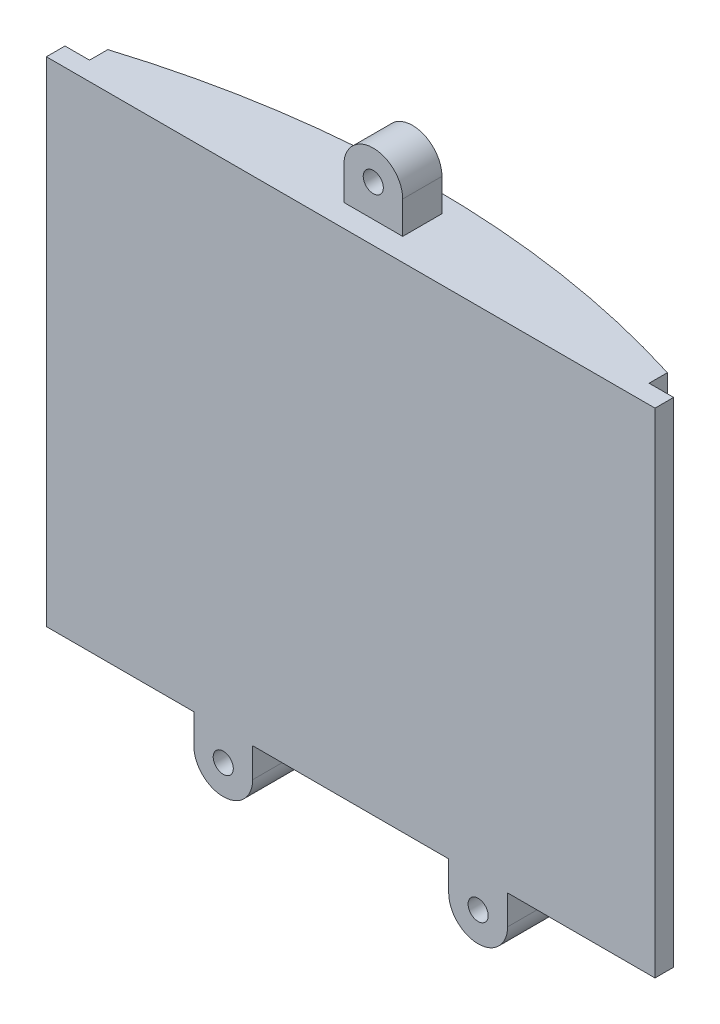
ISO-10303-21;
HEADER;
FILE_DESCRIPTION(('STEP AP214'),'2;1');
FILE_NAME('part.step','',(''),(''),'','','');
FILE_SCHEMA(('AUTOMOTIVE_DESIGN { 1 0 10303 214 1 1 1 1 }'));
ENDSEC;
DATA;
#1=APPLICATION_CONTEXT('core data for automotive mechanical design processes');
#2=APPLICATION_PROTOCOL_DEFINITION('international standard','automotive_design',2000,#1);
#3=PRODUCT_CONTEXT('',#1,'mechanical');
#4=PRODUCT('Part','Part','',(#3));
#5=PRODUCT_RELATED_PRODUCT_CATEGORY('part','',(#4));
#6=PRODUCT_DEFINITION_FORMATION('','',#4);
#7=PRODUCT_DEFINITION_CONTEXT('part definition',#1,'design');
#8=PRODUCT_DEFINITION('design','',#6,#7);
#9=PRODUCT_DEFINITION_SHAPE('','',#8);
#10=(LENGTH_UNIT() NAMED_UNIT(*) SI_UNIT(.MILLI.,.METRE.));
#11=(NAMED_UNIT(*) PLANE_ANGLE_UNIT() SI_UNIT($,.RADIAN.));
#12=(NAMED_UNIT(*) SI_UNIT($,.STERADIAN.) SOLID_ANGLE_UNIT());
#13=UNCERTAINTY_MEASURE_WITH_UNIT(LENGTH_MEASURE(1.E-05),#10,'distance_accuracy_value','');
#14=(GEOMETRIC_REPRESENTATION_CONTEXT(3) GLOBAL_UNCERTAINTY_ASSIGNED_CONTEXT((#13)) GLOBAL_UNIT_ASSIGNED_CONTEXT((#10,
#11,#12)) REPRESENTATION_CONTEXT('',''));
#15=CARTESIAN_POINT('',(0.,0.,0.));
#16=DIRECTION('',(0.,0.,1.));
#17=DIRECTION('',(1.,0.,0.));
#18=AXIS2_PLACEMENT_3D('',#15,#16,#17);
#19=CARTESIAN_POINT('',(0.,-40.9446130729417,50.1876320685335));
#20=DIRECTION('',(0.,-1.,0.));
#21=DIRECTION('',(0.,0.,-1.));
#22=AXIS2_PLACEMENT_3D('',#19,#20,#21);
#23=PLANE('',#22);
#24=DIRECTION('',(-1.,0.,0.));
#25=VECTOR('',#24,1.);
#26=CARTESIAN_POINT('',(-31.0149761749015,-40.9446130729417,-37.3));
#27=LINE('',#26,#25);
#28=CARTESIAN_POINT('',(31.0149761749015,-40.9446130729417,-37.3));
#29=VERTEX_POINT('',#28);
#30=CARTESIAN_POINT('',(15.9891024077721,-40.9446130729417,-37.3));
#31=VERTEX_POINT('',#30);
#32=EDGE_CURVE('E281',#29,#31,#27,.T.);
#33=ORIENTED_EDGE('',*,*,#32,.T.);
#34=DIRECTION('',(0.,0.,1.));
#35=VECTOR('',#34,1.);
#36=CARTESIAN_POINT('',(15.9891024077721,-40.9446130729417,-42.3));
#37=LINE('',#36,#35);
#38=CARTESIAN_POINT('',(15.9891024077721,-40.9446130729417,-42.3));
#39=VERTEX_POINT('',#38);
#40=EDGE_CURVE('E65',#39,#31,#37,.T.);
#41=ORIENTED_EDGE('',*,*,#40,.F.);
#42=DIRECTION('',(-1.,0.,0.));
#43=VECTOR('',#42,1.);
#44=CARTESIAN_POINT('',(0.,-40.9446130729417,-42.3));
#45=LINE('',#44,#43);
#46=CARTESIAN_POINT('',(9.9891024077721,-40.9446130729417,-42.3));
#47=VERTEX_POINT('',#46);
#48=EDGE_CURVE('E220',#39,#47,#45,.T.);
#49=ORIENTED_EDGE('',*,*,#48,.T.);
#50=DIRECTION('',(0.,0.,1.));
#51=VECTOR('',#50,1.);
#52=CARTESIAN_POINT('',(9.9891024077721,-40.9446130729417,-42.3));
#53=LINE('',#52,#51);
#54=CARTESIAN_POINT('',(9.9891024077721,-40.9446130729417,-37.3));
#55=VERTEX_POINT('',#54);
#56=EDGE_CURVE('E212',#47,#55,#53,.T.);
#57=ORIENTED_EDGE('',*,*,#56,.T.);
#58=CARTESIAN_POINT('',(-9.98910240777212,-40.9446130729417,-37.3));
#59=VERTEX_POINT('',#58);
#60=EDGE_CURVE('E283',#55,#59,#27,.T.);
#61=ORIENTED_EDGE('',*,*,#60,.T.);
#62=DIRECTION('',(0.,0.,1.));
#63=VECTOR('',#62,1.);
#64=CARTESIAN_POINT('',(-9.98910240777212,-40.9446130729417,-42.3));
#65=LINE('',#64,#63);
#66=CARTESIAN_POINT('',(-9.98910240777212,-40.9446130729417,-42.3));
#67=VERTEX_POINT('',#66);
#68=EDGE_CURVE('E255',#67,#59,#65,.T.);
#69=ORIENTED_EDGE('',*,*,#68,.F.);
#70=DIRECTION('',(-1.,0.,0.));
#71=VECTOR('',#70,1.);
#72=CARTESIAN_POINT('',(0.,-40.9446130729417,-42.3));
#73=LINE('',#72,#71);
#74=CARTESIAN_POINT('',(-15.9891024077721,-40.9446130729417,-42.3));
#75=VERTEX_POINT('',#74);
#76=EDGE_CURVE('E232',#67,#75,#73,.T.);
#77=ORIENTED_EDGE('',*,*,#76,.T.);
#78=DIRECTION('',(0.,0.,1.));
#79=VECTOR('',#78,1.);
#80=CARTESIAN_POINT('',(-15.9891024077721,-40.9446130729417,-42.3));
#81=LINE('',#80,#79);
#82=CARTESIAN_POINT('',(-15.9891024077721,-40.9446130729417,-37.3));
#83=VERTEX_POINT('',#82);
#84=EDGE_CURVE('E242',#75,#83,#81,.T.);
#85=ORIENTED_EDGE('',*,*,#84,.T.);
#86=CARTESIAN_POINT('',(-31.0149761749015,-40.9446130729417,-37.3));
#87=VERTEX_POINT('',#86);
#88=EDGE_CURVE('E258',#83,#87,#27,.T.);
#89=ORIENTED_EDGE('',*,*,#88,.T.);
#90=DIRECTION('',(0.,0.,-1.));
#91=VECTOR('',#90,1.);
#92=CARTESIAN_POINT('',(-31.0149761749015,-40.9446130729417,-37.3));
#93=LINE('',#92,#91);
#94=CARTESIAN_POINT('',(-31.0149761749015,-40.9446130729417,-39.1966199322564));
#95=VERTEX_POINT('',#94);
#96=EDGE_CURVE('E278',#87,#95,#93,.T.);
#97=ORIENTED_EDGE('',*,*,#96,.T.);
#98=DIRECTION('',(1.,0.,0.));
#99=VECTOR('',#98,1.);
#100=CARTESIAN_POINT('',(-31.0149761749015,-40.9446130729417,-39.1966199322564));
#101=LINE('',#100,#99);
#102=CARTESIAN_POINT('',(-28.5149761749015,-40.9446130729417,-39.1966199322564));
#103=VERTEX_POINT('',#102);
#104=EDGE_CURVE('E275',#95,#103,#101,.T.);
#105=ORIENTED_EDGE('',*,*,#104,.T.);
#106=DIRECTION('',(0.,0.,-1.));
#107=VECTOR('',#106,1.);
#108=CARTESIAN_POINT('',(-28.5149761749015,-40.9446130729417,-39.1966199322564));
#109=LINE('',#108,#107);
#110=CARTESIAN_POINT('',(-28.5149761749015,-40.9446130729417,-41.0627014249678));
#111=VERTEX_POINT('',#110);
#112=EDGE_CURVE('E272',#103,#111,#109,.T.);
#113=ORIENTED_EDGE('',*,*,#112,.T.);
#114=CARTESIAN_POINT('',(0.,-40.9446130729417,50.1876320685335));
#115=DIRECTION('',(0.,-1.,0.));
#116=DIRECTION('',(0.,0.,-1.));
#117=AXIS2_PLACEMENT_3D('',#114,#115,#116);
#118=CIRCLE('',#117,95.6019206341086);
#119=CARTESIAN_POINT('',(28.5149761749016,-40.9446130729417,-41.0627014249677));
#120=VERTEX_POINT('',#119);
#121=EDGE_CURVE('E269',#111,#120,#118,.T.);
#122=ORIENTED_EDGE('',*,*,#121,.T.);
#123=DIRECTION('',(0.,0.,1.));
#124=VECTOR('',#123,1.);
#125=CARTESIAN_POINT('',(28.5149761749015,-40.9446130729417,-39.1966199322563));
#126=LINE('',#125,#124);
#127=CARTESIAN_POINT('',(28.5149761749015,-40.9446130729417,-39.1966199322563));
#128=VERTEX_POINT('',#127);
#129=EDGE_CURVE('E266',#120,#128,#126,.T.);
#130=ORIENTED_EDGE('',*,*,#129,.T.);
#131=DIRECTION('',(1.,0.,0.));
#132=VECTOR('',#131,1.);
#133=CARTESIAN_POINT('',(31.0149761749015,-40.9446130729417,-39.1966199322563));
#134=LINE('',#133,#132);
#135=CARTESIAN_POINT('',(31.0149761749015,-40.9446130729417,-39.1966199322563));
#136=VERTEX_POINT('',#135);
#137=EDGE_CURVE('E263',#128,#136,#134,.T.);
#138=ORIENTED_EDGE('',*,*,#137,.T.);
#139=DIRECTION('',(0.,0.,1.));
#140=VECTOR('',#139,1.);
#141=CARTESIAN_POINT('',(31.0149761749015,-40.9446130729417,-37.3));
#142=LINE('',#141,#140);
#143=EDGE_CURVE('E259',#136,#29,#142,.T.);
#144=ORIENTED_EDGE('',*,*,#143,.T.);
#145=EDGE_LOOP('',(#33,#41,#49,#57,#61,#69,#77,#85,#89,#97,#105,#113,#122,#130,#138,#144));
#146=FACE_BOUND('',#145,.T.);
#147=ADVANCED_FACE('F42',(#146),#23,.T.);
#148=CARTESIAN_POINT('',(0.,9.35538692705828,-27.));
#149=DIRECTION('',(0.,1.,0.));
#150=DIRECTION('',(0.,0.,1.));
#151=AXIS2_PLACEMENT_3D('',#148,#149,#150);
#152=PLANE('',#151);
#153=DIRECTION('',(-1.,0.,0.));
#154=VECTOR('',#153,1.);
#155=CARTESIAN_POINT('',(0.,9.35538692705828,-43.6));
#156=LINE('',#155,#154);
#157=CARTESIAN_POINT('',(3.,9.35538692705828,-43.6));
#158=VERTEX_POINT('',#157);
#159=CARTESIAN_POINT('',(-3.,9.35538692705828,-43.6));
#160=VERTEX_POINT('',#159);
#161=EDGE_CURVE('E11',#158,#160,#156,.T.);
#162=ORIENTED_EDGE('',*,*,#161,.F.);
#163=DIRECTION('',(0.,0.,1.));
#164=VECTOR('',#163,1.);
#165=CARTESIAN_POINT('',(3.,9.35538692705828,-27.));
#166=LINE('',#165,#164);
#167=CARTESIAN_POINT('',(3.,9.35538692705828,-39.6));
#168=VERTEX_POINT('',#167);
#169=EDGE_CURVE('E50',#158,#168,#166,.T.);
#170=ORIENTED_EDGE('',*,*,#169,.T.);
#171=DIRECTION('',(-1.,0.,0.));
#172=VECTOR('',#171,1.);
#173=CARTESIAN_POINT('',(0.,9.35538692705828,-39.6));
#174=LINE('',#173,#172);
#175=CARTESIAN_POINT('',(-3.,9.35538692705828,-39.6));
#176=VERTEX_POINT('',#175);
#177=EDGE_CURVE('E324',#168,#176,#174,.T.);
#178=ORIENTED_EDGE('',*,*,#177,.T.);
#179=DIRECTION('',(0.,0.,-1.));
#180=VECTOR('',#179,1.);
#181=CARTESIAN_POINT('',(-3.,9.35538692705828,-27.));
#182=LINE('',#181,#180);
#183=EDGE_CURVE('E327',#176,#160,#182,.T.);
#184=ORIENTED_EDGE('',*,*,#183,.T.);
#185=EDGE_LOOP('',(#162,#170,#178,#184));
#186=FACE_BOUND('',#185,.T.);
#187=DIRECTION('',(-1.,0.,0.));
#188=VECTOR('',#187,1.);
#189=CARTESIAN_POINT('',(-31.0149761749015,9.35538692705828,-37.3));
#190=LINE('',#189,#188);
#191=CARTESIAN_POINT('',(31.0149761749015,9.35538692705828,-37.3));
#192=VERTEX_POINT('',#191);
#193=CARTESIAN_POINT('',(-31.0149761749015,9.35538692705828,-37.3));
#194=VERTEX_POINT('',#193);
#195=EDGE_CURVE('E287',#192,#194,#190,.T.);
#196=ORIENTED_EDGE('',*,*,#195,.F.);
#197=DIRECTION('',(0.,0.,1.));
#198=VECTOR('',#197,1.);
#199=CARTESIAN_POINT('',(31.0149761749015,9.35538692705828,-37.3));
#200=LINE('',#199,#198);
#201=CARTESIAN_POINT('',(31.0149761749015,9.35538692705828,-39.1966199322563));
#202=VERTEX_POINT('',#201);
#203=EDGE_CURVE('E292',#202,#192,#200,.T.);
#204=ORIENTED_EDGE('',*,*,#203,.F.);
#205=DIRECTION('',(1.,0.,0.));
#206=VECTOR('',#205,1.);
#207=CARTESIAN_POINT('',(31.0149761749015,9.35538692705828,-39.1966199322563));
#208=LINE('',#207,#206);
#209=CARTESIAN_POINT('',(28.5149761749015,9.35538692705828,-39.1966199322563));
#210=VERTEX_POINT('',#209);
#211=EDGE_CURVE('E296',#210,#202,#208,.T.);
#212=ORIENTED_EDGE('',*,*,#211,.F.);
#213=DIRECTION('',(0.,0.,1.));
#214=VECTOR('',#213,1.);
#215=CARTESIAN_POINT('',(28.5149761749015,9.35538692705828,-39.1966199322563));
#216=LINE('',#215,#214);
#217=CARTESIAN_POINT('',(28.5149761749016,9.35538692705828,-41.0627014249677));
#218=VERTEX_POINT('',#217);
#219=EDGE_CURVE('E300',#218,#210,#216,.T.);
#220=ORIENTED_EDGE('',*,*,#219,.F.);
#221=CARTESIAN_POINT('',(0.,9.35538692705828,50.1876320685335));
#222=DIRECTION('',(0.,1.,0.));
#223=DIRECTION('',(0.,0.,1.));
#224=AXIS2_PLACEMENT_3D('',#221,#222,#223);
#225=CIRCLE('',#224,95.6019206341086);
#226=CARTESIAN_POINT('',(-28.5149761749015,9.35538692705828,-41.0627014249678));
#227=VERTEX_POINT('',#226);
#228=EDGE_CURVE('E304',#227,#218,#225,.F.);
#229=ORIENTED_EDGE('',*,*,#228,.F.);
#230=DIRECTION('',(0.,0.,-1.));
#231=VECTOR('',#230,1.);
#232=CARTESIAN_POINT('',(-28.5149761749015,9.35538692705828,-39.1966199322564));
#233=LINE('',#232,#231);
#234=CARTESIAN_POINT('',(-28.5149761749015,9.35538692705828,-39.1966199322564));
#235=VERTEX_POINT('',#234);
#236=EDGE_CURVE('E308',#235,#227,#233,.T.);
#237=ORIENTED_EDGE('',*,*,#236,.F.);
#238=DIRECTION('',(1.,0.,0.));
#239=VECTOR('',#238,1.);
#240=CARTESIAN_POINT('',(-31.0149761749015,9.35538692705828,-39.1966199322564));
#241=LINE('',#240,#239);
#242=CARTESIAN_POINT('',(-31.0149761749015,9.35538692705828,-39.1966199322564));
#243=VERTEX_POINT('',#242);
#244=EDGE_CURVE('E312',#243,#235,#241,.T.);
#245=ORIENTED_EDGE('',*,*,#244,.F.);
#246=DIRECTION('',(0.,0.,-1.));
#247=VECTOR('',#246,1.);
#248=CARTESIAN_POINT('',(-31.0149761749015,9.35538692705828,-37.3));
#249=LINE('',#248,#247);
#250=EDGE_CURVE('E262',#194,#243,#249,.T.);
#251=ORIENTED_EDGE('',*,*,#250,.F.);
#252=EDGE_LOOP('',(#196,#204,#212,#220,#229,#237,#245,#251));
#253=FACE_BOUND('',#252,.T.);
#254=ADVANCED_FACE('F44',(#186,#253),#152,.T.);
#255=CARTESIAN_POINT('',(-31.0149761749015,72.2138129578038,-37.3));
#256=DIRECTION('',(-1.,0.,0.));
#257=DIRECTION('',(0.,0.,1.));
#258=AXIS2_PLACEMENT_3D('',#255,#256,#257);
#259=PLANE('',#258);
#260=DIRECTION('',(0.,-1.,0.));
#261=VECTOR('',#260,1.);
#262=CARTESIAN_POINT('',(-31.0149761749015,72.2138129578038,-37.3));
#263=LINE('',#262,#261);
#264=EDGE_CURVE('E290',#194,#87,#263,.T.);
#265=ORIENTED_EDGE('',*,*,#264,.F.);
#266=ORIENTED_EDGE('',*,*,#250,.T.);
#267=DIRECTION('',(0.,-1.,0.));
#268=VECTOR('',#267,1.);
#269=CARTESIAN_POINT('',(-31.0149761749015,72.2138129578038,-39.1966199322564));
#270=LINE('',#269,#268);
#271=EDGE_CURVE('E286',#243,#95,#270,.T.);
#272=ORIENTED_EDGE('',*,*,#271,.T.);
#273=ORIENTED_EDGE('',*,*,#96,.F.);
#274=EDGE_LOOP('',(#265,#266,#272,#273));
#275=FACE_BOUND('',#274,.T.);
#276=ADVANCED_FACE('F359',(#275),#259,.T.);
#277=CARTESIAN_POINT('',(-31.0149761749015,72.2138129578038,-39.1966199322564));
#278=DIRECTION('',(0.,0.,-1.));
#279=DIRECTION('',(-1.,0.,0.));
#280=AXIS2_PLACEMENT_3D('',#277,#278,#279);
#281=PLANE('',#280);
#282=ORIENTED_EDGE('',*,*,#271,.F.);
#283=ORIENTED_EDGE('',*,*,#244,.T.);
#284=DIRECTION('',(0.,-1.,0.));
#285=VECTOR('',#284,1.);
#286=CARTESIAN_POINT('',(-28.5149761749015,72.2138129578038,-39.1966199322564));
#287=LINE('',#286,#285);
#288=EDGE_CURVE('E311',#235,#103,#287,.T.);
#289=ORIENTED_EDGE('',*,*,#288,.T.);
#290=ORIENTED_EDGE('',*,*,#104,.F.);
#291=EDGE_LOOP('',(#282,#283,#289,#290));
#292=FACE_BOUND('',#291,.T.);
#293=ADVANCED_FACE('F387',(#292),#281,.T.);
#294=CARTESIAN_POINT('',(-28.5149761749015,72.2138129578038,-39.1966199322564));
#295=DIRECTION('',(-1.,0.,0.));
#296=DIRECTION('',(0.,0.,1.));
#297=AXIS2_PLACEMENT_3D('',#294,#295,#296);
#298=PLANE('',#297);
#299=ORIENTED_EDGE('',*,*,#288,.F.);
#300=ORIENTED_EDGE('',*,*,#236,.T.);
#301=DIRECTION('',(0.,-1.,0.));
#302=VECTOR('',#301,1.);
#303=CARTESIAN_POINT('',(-28.5149761749015,72.2138129578038,-41.0627014249678));
#304=LINE('',#303,#302);
#305=EDGE_CURVE('E307',#227,#111,#304,.T.);
#306=ORIENTED_EDGE('',*,*,#305,.T.);
#307=ORIENTED_EDGE('',*,*,#112,.F.);
#308=EDGE_LOOP('',(#299,#300,#306,#307));
#309=FACE_BOUND('',#308,.T.);
#310=ADVANCED_FACE('F383',(#309),#298,.T.);
#311=CARTESIAN_POINT('',(0.,72.2138129578038,50.1876320685335));
#312=DIRECTION('',(0.,-1.,0.));
#313=DIRECTION('',(0.,0.,-1.));
#314=AXIS2_PLACEMENT_3D('',#311,#312,#313);
#315=CYLINDRICAL_SURFACE('',#314,95.6019206341086);
#316=ORIENTED_EDGE('',*,*,#305,.F.);
#317=ORIENTED_EDGE('',*,*,#228,.T.);
#318=DIRECTION('',(0.,-1.,0.));
#319=VECTOR('',#318,1.);
#320=CARTESIAN_POINT('',(28.5149761749016,72.2138129578038,-41.0627014249677));
#321=LINE('',#320,#319);
#322=EDGE_CURVE('E303',#218,#120,#321,.T.);
#323=ORIENTED_EDGE('',*,*,#322,.T.);
#324=ORIENTED_EDGE('',*,*,#121,.F.);
#325=EDGE_LOOP('',(#316,#317,#323,#324));
#326=FACE_BOUND('',#325,.T.);
#327=ADVANCED_FACE('F379',(#326),#315,.T.);
#328=CARTESIAN_POINT('',(28.5149761749015,72.2138129578038,-39.1966199322563));
#329=DIRECTION('',(1.,0.,0.));
#330=DIRECTION('',(0.,0.,-1.));
#331=AXIS2_PLACEMENT_3D('',#328,#329,#330);
#332=PLANE('',#331);
#333=ORIENTED_EDGE('',*,*,#322,.F.);
#334=ORIENTED_EDGE('',*,*,#219,.T.);
#335=DIRECTION('',(0.,-1.,0.));
#336=VECTOR('',#335,1.);
#337=CARTESIAN_POINT('',(28.5149761749015,72.2138129578038,-39.1966199322563));
#338=LINE('',#337,#336);
#339=EDGE_CURVE('E299',#210,#128,#338,.T.);
#340=ORIENTED_EDGE('',*,*,#339,.T.);
#341=ORIENTED_EDGE('',*,*,#129,.F.);
#342=EDGE_LOOP('',(#333,#334,#340,#341));
#343=FACE_BOUND('',#342,.T.);
#344=ADVANCED_FACE('F375',(#343),#332,.T.);
#345=CARTESIAN_POINT('',(31.0149761749015,72.2138129578038,-39.1966199322563));
#346=DIRECTION('',(0.,0.,-1.));
#347=DIRECTION('',(-1.,0.,0.));
#348=AXIS2_PLACEMENT_3D('',#345,#346,#347);
#349=PLANE('',#348);
#350=ORIENTED_EDGE('',*,*,#339,.F.);
#351=ORIENTED_EDGE('',*,*,#211,.T.);
#352=DIRECTION('',(0.,-1.,0.));
#353=VECTOR('',#352,1.);
#354=CARTESIAN_POINT('',(31.0149761749015,72.2138129578038,-39.1966199322563));
#355=LINE('',#354,#353);
#356=EDGE_CURVE('E295',#202,#136,#355,.T.);
#357=ORIENTED_EDGE('',*,*,#356,.T.);
#358=ORIENTED_EDGE('',*,*,#137,.F.);
#359=EDGE_LOOP('',(#350,#351,#357,#358));
#360=FACE_BOUND('',#359,.T.);
#361=ADVANCED_FACE('F371',(#360),#349,.T.);
#362=CARTESIAN_POINT('',(31.0149761749015,72.2138129578038,-37.3));
#363=DIRECTION('',(1.,0.,0.));
#364=DIRECTION('',(0.,0.,-1.));
#365=AXIS2_PLACEMENT_3D('',#362,#363,#364);
#366=PLANE('',#365);
#367=ORIENTED_EDGE('',*,*,#356,.F.);
#368=ORIENTED_EDGE('',*,*,#203,.T.);
#369=DIRECTION('',(0.,-1.,0.));
#370=VECTOR('',#369,1.);
#371=CARTESIAN_POINT('',(31.0149761749015,72.2138129578038,-37.3));
#372=LINE('',#371,#370);
#373=EDGE_CURVE('E291',#192,#29,#372,.T.);
#374=ORIENTED_EDGE('',*,*,#373,.T.);
#375=ORIENTED_EDGE('',*,*,#143,.F.);
#376=EDGE_LOOP('',(#367,#368,#374,#375));
#377=FACE_BOUND('',#376,.T.);
#378=ADVANCED_FACE('F367',(#377),#366,.T.);
#379=CARTESIAN_POINT('',(-31.0149761749015,72.2138129578038,-37.3));
#380=DIRECTION('',(0.,0.,1.));
#381=DIRECTION('',(1.,0.,0.));
#382=AXIS2_PLACEMENT_3D('',#379,#380,#381);
#383=PLANE('',#382);
#384=CARTESIAN_POINT('',(-12.9891024077721,-43.9446130729417,-37.3));
#385=DIRECTION('',(0.,0.,1.));
#386=DIRECTION('',(1.,0.,0.));
#387=AXIS2_PLACEMENT_3D('',#384,#385,#386);
#388=CIRCLE('',#387,1.02499999999999);
#389=CARTESIAN_POINT('',(-11.9641024077721,-43.9446130729417,-37.3));
#390=VERTEX_POINT('',#389);
#391=EDGE_CURVE('E840',#390,#390,#388,.T.);
#392=ORIENTED_EDGE('',*,*,#391,.F.);
#393=EDGE_LOOP('',(#392));
#394=FACE_BOUND('',#393,.T.);
#395=CARTESIAN_POINT('',(12.9891024077721,-43.9446130729417,-37.3));
#396=DIRECTION('',(0.,0.,1.));
#397=DIRECTION('',(1.,0.,0.));
#398=AXIS2_PLACEMENT_3D('',#395,#396,#397);
#399=CIRCLE('',#398,1.02499999999999);
#400=CARTESIAN_POINT('',(14.0141024077721,-43.9446130729417,-37.3));
#401=VERTEX_POINT('',#400);
#402=EDGE_CURVE('E834',#401,#401,#399,.T.);
#403=ORIENTED_EDGE('',*,*,#402,.F.);
#404=EDGE_LOOP('',(#403));
#405=FACE_BOUND('',#404,.T.);
#406=ORIENTED_EDGE('',*,*,#373,.F.);
#407=ORIENTED_EDGE('',*,*,#195,.T.);
#408=ORIENTED_EDGE('',*,*,#264,.T.);
#409=ORIENTED_EDGE('',*,*,#88,.F.);
#410=DIRECTION('',(0.,1.,0.));
#411=VECTOR('',#410,1.);
#412=CARTESIAN_POINT('',(-15.9891024077721,0.,-37.3));
#413=LINE('',#412,#411);
#414=CARTESIAN_POINT('',(-15.9891024077721,-43.9446130729417,-37.3));
#415=VERTEX_POINT('',#414);
#416=EDGE_CURVE('E236',#415,#83,#413,.T.);
#417=ORIENTED_EDGE('',*,*,#416,.F.);
#418=CARTESIAN_POINT('',(-12.9891024077721,-43.9446130729417,-37.3));
#419=DIRECTION('',(0.,0.,-1.));
#420=DIRECTION('',(-1.,0.,0.));
#421=AXIS2_PLACEMENT_3D('',#418,#419,#420);
#422=CIRCLE('',#421,3.);
#423=CARTESIAN_POINT('',(-9.98910240777212,-43.9446130729417,-37.3));
#424=VERTEX_POINT('',#423);
#425=EDGE_CURVE('E244',#424,#415,#422,.T.);
#426=ORIENTED_EDGE('',*,*,#425,.F.);
#427=DIRECTION('',(0.,-1.,0.));
#428=VECTOR('',#427,1.);
#429=CARTESIAN_POINT('',(-9.98910240777217,0.,-37.3));
#430=LINE('',#429,#428);
#431=EDGE_CURVE('E224',#59,#424,#430,.T.);
#432=ORIENTED_EDGE('',*,*,#431,.F.);
#433=ORIENTED_EDGE('',*,*,#60,.F.);
#434=DIRECTION('',(0.,1.,0.));
#435=VECTOR('',#434,1.);
#436=CARTESIAN_POINT('',(9.98910240777217,0.,-37.3));
#437=LINE('',#436,#435);
#438=CARTESIAN_POINT('',(9.98910240777212,-43.9446130729417,-37.3));
#439=VERTEX_POINT('',#438);
#440=EDGE_CURVE('E216',#439,#55,#437,.T.);
#441=ORIENTED_EDGE('',*,*,#440,.F.);
#442=CARTESIAN_POINT('',(12.9891024077721,-43.9446130729417,-37.3));
#443=DIRECTION('',(0.,0.,-1.));
#444=DIRECTION('',(-1.,0.,0.));
#445=AXIS2_PLACEMENT_3D('',#442,#443,#444);
#446=CIRCLE('',#445,3.);
#447=CARTESIAN_POINT('',(15.9891024077721,-43.9446130729417,-37.3));
#448=VERTEX_POINT('',#447);
#449=EDGE_CURVE('E219',#448,#439,#446,.T.);
#450=ORIENTED_EDGE('',*,*,#449,.F.);
#451=DIRECTION('',(0.,-1.,0.));
#452=VECTOR('',#451,1.);
#453=CARTESIAN_POINT('',(15.9891024077721,0.,-37.3));
#454=LINE('',#453,#452);
#455=EDGE_CURVE('E222',#31,#448,#454,.T.);
#456=ORIENTED_EDGE('',*,*,#455,.F.);
#457=ORIENTED_EDGE('',*,*,#32,.F.);
#458=EDGE_LOOP('',(#406,#407,#408,#409,#417,#426,#432,#433,#441,#450,#456,#457));
#459=FACE_BOUND('',#458,.T.);
#460=ADVANCED_FACE('F364',(#394,#405,#459),#383,.T.);
#461=CARTESIAN_POINT('',(-9.98910240777217,0.,-42.3));
#462=DIRECTION('',(-1.,0.,0.));
#463=DIRECTION('',(0.,-1.,0.));
#464=AXIS2_PLACEMENT_3D('',#461,#462,#463);
#465=PLANE('',#464);
#466=ORIENTED_EDGE('',*,*,#431,.T.);
#467=DIRECTION('',(0.,0.,1.));
#468=VECTOR('',#467,1.);
#469=CARTESIAN_POINT('',(-9.98910240777212,-43.9446130729417,-42.3));
#470=LINE('',#469,#468);
#471=CARTESIAN_POINT('',(-9.98910240777212,-43.9446130729417,-42.3));
#472=VERTEX_POINT('',#471);
#473=EDGE_CURVE('E252',#472,#424,#470,.T.);
#474=ORIENTED_EDGE('',*,*,#473,.F.);
#475=DIRECTION('',(0.,-1.,0.));
#476=VECTOR('',#475,1.);
#477=CARTESIAN_POINT('',(-9.98910240777217,0.,-42.3));
#478=LINE('',#477,#476);
#479=EDGE_CURVE('E235',#67,#472,#478,.T.);
#480=ORIENTED_EDGE('',*,*,#479,.F.);
#481=ORIENTED_EDGE('',*,*,#68,.T.);
#482=EDGE_LOOP('',(#466,#474,#480,#481));
#483=FACE_BOUND('',#482,.T.);
#484=ADVANCED_FACE('F362',(#483),#465,.F.);
#485=CARTESIAN_POINT('',(-12.9891024077721,-43.9446130729417,-42.3));
#486=DIRECTION('',(0.,0.,1.));
#487=DIRECTION('',(1.,0.,0.));
#488=AXIS2_PLACEMENT_3D('',#485,#486,#487);
#489=CYLINDRICAL_SURFACE('',#488,3.);
#490=ORIENTED_EDGE('',*,*,#425,.T.);
#491=DIRECTION('',(0.,0.,1.));
#492=VECTOR('',#491,1.);
#493=CARTESIAN_POINT('',(-15.9891024077721,-43.9446130729417,-42.3));
#494=LINE('',#493,#492);
#495=CARTESIAN_POINT('',(-15.9891024077721,-43.9446130729417,-42.3));
#496=VERTEX_POINT('',#495);
#497=EDGE_CURVE('E249',#496,#415,#494,.T.);
#498=ORIENTED_EDGE('',*,*,#497,.F.);
#499=CARTESIAN_POINT('',(-12.9891024077721,-43.9446130729417,-42.3));
#500=DIRECTION('',(0.,0.,-1.));
#501=DIRECTION('',(-1.,0.,0.));
#502=AXIS2_PLACEMENT_3D('',#499,#500,#501);
#503=CIRCLE('',#502,3.);
#504=EDGE_CURVE('E238',#472,#496,#503,.T.);
#505=ORIENTED_EDGE('',*,*,#504,.F.);
#506=ORIENTED_EDGE('',*,*,#473,.T.);
#507=EDGE_LOOP('',(#490,#498,#505,#506));
#508=FACE_BOUND('',#507,.T.);
#509=ADVANCED_FACE('F418',(#508),#489,.T.);
#510=CARTESIAN_POINT('',(-15.9891024077721,0.,-42.3));
#511=DIRECTION('',(1.,0.,0.));
#512=DIRECTION('',(0.,0.,-1.));
#513=AXIS2_PLACEMENT_3D('',#510,#511,#512);
#514=PLANE('',#513);
#515=ORIENTED_EDGE('',*,*,#416,.T.);
#516=ORIENTED_EDGE('',*,*,#84,.F.);
#517=DIRECTION('',(0.,1.,0.));
#518=VECTOR('',#517,1.);
#519=CARTESIAN_POINT('',(-15.9891024077721,0.,-42.3));
#520=LINE('',#519,#518);
#521=EDGE_CURVE('E240',#496,#75,#520,.T.);
#522=ORIENTED_EDGE('',*,*,#521,.F.);
#523=ORIENTED_EDGE('',*,*,#497,.T.);
#524=EDGE_LOOP('',(#515,#516,#522,#523));
#525=FACE_BOUND('',#524,.T.);
#526=ADVANCED_FACE('F422',(#525),#514,.F.);
#527=CARTESIAN_POINT('',(0.,0.,-42.3));
#528=DIRECTION('',(0.,0.,-1.));
#529=DIRECTION('',(-1.,0.,0.));
#530=AXIS2_PLACEMENT_3D('',#527,#528,#529);
#531=PLANE('',#530);
#532=CARTESIAN_POINT('',(-12.9891024077721,-43.9446130729417,-42.3));
#533=DIRECTION('',(0.,0.,-1.));
#534=DIRECTION('',(-1.,0.,0.));
#535=AXIS2_PLACEMENT_3D('',#532,#533,#534);
#536=CIRCLE('',#535,2.5);
#537=CARTESIAN_POINT('',(-15.4891024077721,-43.9446130729417,-42.3));
#538=VERTEX_POINT('',#537);
#539=EDGE_CURVE('E809',#538,#538,#536,.T.);
#540=ORIENTED_EDGE('',*,*,#539,.F.);
#541=EDGE_LOOP('',(#540));
#542=FACE_BOUND('',#541,.T.);
#543=ORIENTED_EDGE('',*,*,#76,.F.);
#544=ORIENTED_EDGE('',*,*,#479,.T.);
#545=ORIENTED_EDGE('',*,*,#504,.T.);
#546=ORIENTED_EDGE('',*,*,#521,.T.);
#547=EDGE_LOOP('',(#543,#544,#545,#546));
#548=FACE_BOUND('',#547,.T.);
#549=ADVANCED_FACE('F424',(#542,#548),#531,.T.);
#550=CARTESIAN_POINT('',(15.9891024077721,0.,-42.3));
#551=DIRECTION('',(-1.,0.,0.));
#552=DIRECTION('',(0.,0.,1.));
#553=AXIS2_PLACEMENT_3D('',#550,#551,#552);
#554=PLANE('',#553);
#555=ORIENTED_EDGE('',*,*,#455,.T.);
#556=DIRECTION('',(0.,0.,1.));
#557=VECTOR('',#556,1.);
#558=CARTESIAN_POINT('',(15.9891024077721,-43.9446130729417,-42.3));
#559=LINE('',#558,#557);
#560=CARTESIAN_POINT('',(15.9891024077721,-43.9446130729417,-42.3));
#561=VERTEX_POINT('',#560);
#562=EDGE_CURVE('E202',#561,#448,#559,.T.);
#563=ORIENTED_EDGE('',*,*,#562,.F.);
#564=DIRECTION('',(0.,-1.,0.));
#565=VECTOR('',#564,1.);
#566=CARTESIAN_POINT('',(15.9891024077721,0.,-42.3));
#567=LINE('',#566,#565);
#568=EDGE_CURVE('E229',#39,#561,#567,.T.);
#569=ORIENTED_EDGE('',*,*,#568,.F.);
#570=ORIENTED_EDGE('',*,*,#40,.T.);
#571=EDGE_LOOP('',(#555,#563,#569,#570));
#572=FACE_BOUND('',#571,.T.);
#573=ADVANCED_FACE('F426',(#572),#554,.F.);
#574=CARTESIAN_POINT('',(12.9891024077721,-43.9446130729417,-42.3));
#575=DIRECTION('',(0.,0.,1.));
#576=DIRECTION('',(1.,0.,0.));
#577=AXIS2_PLACEMENT_3D('',#574,#575,#576);
#578=CYLINDRICAL_SURFACE('',#577,3.);
#579=ORIENTED_EDGE('',*,*,#449,.T.);
#580=DIRECTION('',(0.,0.,1.));
#581=VECTOR('',#580,1.);
#582=CARTESIAN_POINT('',(9.98910240777212,-43.9446130729417,-42.3));
#583=LINE('',#582,#581);
#584=CARTESIAN_POINT('',(9.98910240777212,-43.9446130729417,-42.3));
#585=VERTEX_POINT('',#584);
#586=EDGE_CURVE('E209',#585,#439,#583,.T.);
#587=ORIENTED_EDGE('',*,*,#586,.F.);
#588=CARTESIAN_POINT('',(12.9891024077721,-43.9446130729417,-42.3));
#589=DIRECTION('',(0.,0.,-1.));
#590=DIRECTION('',(-1.,0.,0.));
#591=AXIS2_PLACEMENT_3D('',#588,#589,#590);
#592=CIRCLE('',#591,3.);
#593=EDGE_CURVE('E227',#561,#585,#592,.T.);
#594=ORIENTED_EDGE('',*,*,#593,.F.);
#595=ORIENTED_EDGE('',*,*,#562,.T.);
#596=EDGE_LOOP('',(#579,#587,#594,#595));
#597=FACE_BOUND('',#596,.T.);
#598=ADVANCED_FACE('F433',(#597),#578,.T.);
#599=CARTESIAN_POINT('',(9.98910240777217,0.,-42.3));
#600=DIRECTION('',(1.,0.,0.));
#601=DIRECTION('',(0.,1.,0.));
#602=AXIS2_PLACEMENT_3D('',#599,#600,#601);
#603=PLANE('',#602);
#604=ORIENTED_EDGE('',*,*,#440,.T.);
#605=ORIENTED_EDGE('',*,*,#56,.F.);
#606=DIRECTION('',(0.,1.,0.));
#607=VECTOR('',#606,1.);
#608=CARTESIAN_POINT('',(9.98910240777217,0.,-42.3));
#609=LINE('',#608,#607);
#610=EDGE_CURVE('E215',#585,#47,#609,.T.);
#611=ORIENTED_EDGE('',*,*,#610,.F.);
#612=ORIENTED_EDGE('',*,*,#586,.T.);
#613=EDGE_LOOP('',(#604,#605,#611,#612));
#614=FACE_BOUND('',#613,.T.);
#615=ADVANCED_FACE('F667',(#614),#603,.F.);
#616=CARTESIAN_POINT('',(0.,0.,-42.3));
#617=DIRECTION('',(0.,0.,-1.));
#618=DIRECTION('',(-1.,0.,0.));
#619=AXIS2_PLACEMENT_3D('',#616,#617,#618);
#620=PLANE('',#619);
#621=CARTESIAN_POINT('',(12.9891024077721,-43.9446130729417,-42.3));
#622=DIRECTION('',(0.,0.,-1.));
#623=DIRECTION('',(-1.,0.,0.));
#624=AXIS2_PLACEMENT_3D('',#621,#622,#623);
#625=CIRCLE('',#624,2.5);
#626=CARTESIAN_POINT('',(10.4891024077721,-43.9446130729417,-42.3));
#627=VERTEX_POINT('',#626);
#628=EDGE_CURVE('E807',#627,#627,#625,.T.);
#629=ORIENTED_EDGE('',*,*,#628,.F.);
#630=EDGE_LOOP('',(#629));
#631=FACE_BOUND('',#630,.T.);
#632=ORIENTED_EDGE('',*,*,#48,.F.);
#633=ORIENTED_EDGE('',*,*,#568,.T.);
#634=ORIENTED_EDGE('',*,*,#593,.T.);
#635=ORIENTED_EDGE('',*,*,#610,.T.);
#636=EDGE_LOOP('',(#632,#633,#634,#635));
#637=FACE_BOUND('',#636,.T.);
#638=ADVANCED_FACE('F439',(#631,#637),#620,.T.);
#639=CARTESIAN_POINT('',(0.,12.6553869270583,-43.6));
#640=DIRECTION('',(0.,0.,1.));
#641=DIRECTION('',(1.,0.,0.));
#642=AXIS2_PLACEMENT_3D('',#639,#640,#641);
#643=CYLINDRICAL_SURFACE('',#642,3.);
#644=CARTESIAN_POINT('',(0.,12.6553869270583,-39.6));
#645=DIRECTION('',(0.,0.,-1.));
#646=DIRECTION('',(-1.,0.,0.));
#647=AXIS2_PLACEMENT_3D('',#644,#645,#646);
#648=CIRCLE('',#647,3.);
#649=CARTESIAN_POINT('',(-3.,12.6553869270583,-39.6));
#650=VERTEX_POINT('',#649);
#651=CARTESIAN_POINT('',(3.,12.6553869270583,-39.6));
#652=VERTEX_POINT('',#651);
#653=EDGE_CURVE('E199',#650,#652,#648,.T.);
#654=ORIENTED_EDGE('',*,*,#653,.T.);
#655=DIRECTION('',(0.,0.,1.));
#656=VECTOR('',#655,1.);
#657=CARTESIAN_POINT('',(3.,12.6553869270583,-43.6));
#658=LINE('',#657,#656);
#659=CARTESIAN_POINT('',(3.,12.6553869270583,-43.6));
#660=VERTEX_POINT('',#659);
#661=EDGE_CURVE('E183',#660,#652,#658,.T.);
#662=ORIENTED_EDGE('',*,*,#661,.F.);
#663=CARTESIAN_POINT('',(0.,12.6553869270583,-43.6));
#664=DIRECTION('',(0.,0.,-1.));
#665=DIRECTION('',(-1.,0.,0.));
#666=AXIS2_PLACEMENT_3D('',#663,#664,#665);
#667=CIRCLE('',#666,3.);
#668=CARTESIAN_POINT('',(-3.,12.6553869270583,-43.6));
#669=VERTEX_POINT('',#668);
#670=EDGE_CURVE('E189',#669,#660,#667,.T.);
#671=ORIENTED_EDGE('',*,*,#670,.F.);
#672=DIRECTION('',(0.,0.,1.));
#673=VECTOR('',#672,1.);
#674=CARTESIAN_POINT('',(-3.,12.6553869270583,-43.6));
#675=LINE('',#674,#673);
#676=EDGE_CURVE('E200',#669,#650,#675,.T.);
#677=ORIENTED_EDGE('',*,*,#676,.T.);
#678=EDGE_LOOP('',(#654,#662,#671,#677));
#679=FACE_BOUND('',#678,.T.);
#680=ADVANCED_FACE('F198',(#679),#643,.T.);
#681=CARTESIAN_POINT('',(3.,9.35538692705828,-43.6));
#682=DIRECTION('',(-1.,0.,0.));
#683=DIRECTION('',(0.,0.,1.));
#684=AXIS2_PLACEMENT_3D('',#681,#682,#683);
#685=PLANE('',#684);
#686=ORIENTED_EDGE('',*,*,#169,.F.);
#687=DIRECTION('',(0.,-1.,0.));
#688=VECTOR('',#687,1.);
#689=CARTESIAN_POINT('',(3.,12.6553869270583,-43.6));
#690=LINE('',#689,#688);
#691=EDGE_CURVE('E178',#660,#158,#690,.T.);
#692=ORIENTED_EDGE('',*,*,#691,.F.);
#693=ORIENTED_EDGE('',*,*,#661,.T.);
#694=DIRECTION('',(0.,-1.,0.));
#695=VECTOR('',#694,1.);
#696=CARTESIAN_POINT('',(3.,9.35538692705828,-39.6));
#697=LINE('',#696,#695);
#698=EDGE_CURVE('E336',#652,#168,#697,.T.);
#699=ORIENTED_EDGE('',*,*,#698,.T.);
#700=EDGE_LOOP('',(#686,#692,#693,#699));
#701=FACE_BOUND('',#700,.T.);
#702=ADVANCED_FACE('F180',(#701),#685,.F.);
#703=CARTESIAN_POINT('',(-3.,9.35538692705828,-43.6));
#704=DIRECTION('',(1.,0.,0.));
#705=DIRECTION('',(0.,1.,0.));
#706=AXIS2_PLACEMENT_3D('',#703,#704,#705);
#707=PLANE('',#706);
#708=ORIENTED_EDGE('',*,*,#183,.F.);
#709=DIRECTION('',(0.,1.,0.));
#710=VECTOR('',#709,1.);
#711=CARTESIAN_POINT('',(-3.,9.35538692705828,-39.6));
#712=LINE('',#711,#710);
#713=EDGE_CURVE('E57',#176,#650,#712,.T.);
#714=ORIENTED_EDGE('',*,*,#713,.T.);
#715=ORIENTED_EDGE('',*,*,#676,.F.);
#716=DIRECTION('',(0.,1.,0.));
#717=VECTOR('',#716,1.);
#718=CARTESIAN_POINT('',(-3.,7.46259750665648,-43.6));
#719=LINE('',#718,#717);
#720=EDGE_CURVE('E188',#160,#669,#719,.T.);
#721=ORIENTED_EDGE('',*,*,#720,.F.);
#722=EDGE_LOOP('',(#708,#714,#715,#721));
#723=FACE_BOUND('',#722,.T.);
#724=ADVANCED_FACE('F332',(#723),#707,.F.);
#725=CARTESIAN_POINT('',(0.,12.6553869270583,-43.6));
#726=DIRECTION('',(0.,0.,-1.));
#727=DIRECTION('',(-1.,0.,0.));
#728=AXIS2_PLACEMENT_3D('',#725,#726,#727);
#729=PLANE('',#728);
#730=CARTESIAN_POINT('',(0.,12.6553869270583,-43.6));
#731=DIRECTION('',(0.,0.,-1.));
#732=DIRECTION('',(-1.,0.,0.));
#733=AXIS2_PLACEMENT_3D('',#730,#731,#732);
#734=CIRCLE('',#733,2.5);
#735=CARTESIAN_POINT('',(-2.5,12.6553869270583,-43.6));
#736=VERTEX_POINT('',#735);
#737=EDGE_CURVE('E823',#736,#736,#734,.T.);
#738=ORIENTED_EDGE('',*,*,#737,.F.);
#739=EDGE_LOOP('',(#738));
#740=FACE_BOUND('',#739,.T.);
#741=ORIENTED_EDGE('',*,*,#691,.T.);
#742=ORIENTED_EDGE('',*,*,#161,.T.);
#743=ORIENTED_EDGE('',*,*,#720,.T.);
#744=ORIENTED_EDGE('',*,*,#670,.T.);
#745=EDGE_LOOP('',(#741,#742,#743,#744));
#746=FACE_BOUND('',#745,.T.);
#747=ADVANCED_FACE('F192',(#740,#746),#729,.T.);
#748=CARTESIAN_POINT('',(0.,12.6553869270583,-39.6));
#749=DIRECTION('',(0.,0.,-1.));
#750=DIRECTION('',(-1.,0.,0.));
#751=AXIS2_PLACEMENT_3D('',#748,#749,#750);
#752=PLANE('',#751);
#753=CARTESIAN_POINT('',(0.,12.6553869270583,-39.6));
#754=DIRECTION('',(0.,0.,-1.));
#755=DIRECTION('',(-1.,0.,0.));
#756=AXIS2_PLACEMENT_3D('',#753,#754,#755);
#757=CIRCLE('',#756,1.02499999999999);
#758=CARTESIAN_POINT('',(-1.02499999999999,12.6553869270583,-39.6));
#759=VERTEX_POINT('',#758);
#760=EDGE_CURVE('E828',#759,#759,#757,.T.);
#761=ORIENTED_EDGE('',*,*,#760,.T.);
#762=EDGE_LOOP('',(#761));
#763=FACE_BOUND('',#762,.T.);
#764=ORIENTED_EDGE('',*,*,#177,.F.);
#765=ORIENTED_EDGE('',*,*,#698,.F.);
#766=ORIENTED_EDGE('',*,*,#653,.F.);
#767=ORIENTED_EDGE('',*,*,#713,.F.);
#768=EDGE_LOOP('',(#764,#765,#766,#767));
#769=FACE_BOUND('',#768,.T.);
#770=ADVANCED_FACE('F338',(#763,#769),#752,.F.);
#771=CARTESIAN_POINT('',(12.9891024077721,-43.9446130729417,-39.8));
#772=DIRECTION('',(0.,0.,-1.));
#773=DIRECTION('',(-1.,0.,0.));
#774=AXIS2_PLACEMENT_3D('',#771,#772,#773);
#775=CYLINDRICAL_SURFACE('',#774,2.5);
#776=CARTESIAN_POINT('',(12.9891024077721,-43.9446130729417,-39.8));
#777=DIRECTION('',(0.,0.,-1.));
#778=DIRECTION('',(-1.,0.,0.));
#779=AXIS2_PLACEMENT_3D('',#776,#777,#778);
#780=CIRCLE('',#779,2.5);
#781=CARTESIAN_POINT('',(10.4891024077721,-43.9446130729417,-39.8));
#782=VERTEX_POINT('',#781);
#783=EDGE_CURVE('E337',#782,#782,#780,.T.);
#784=ORIENTED_EDGE('',*,*,#783,.F.);
#785=EDGE_LOOP('',(#784));
#786=FACE_BOUND('',#785,.T.);
#787=ORIENTED_EDGE('',*,*,#628,.T.);
#788=EDGE_LOOP('',(#787));
#789=FACE_BOUND('',#788,.T.);
#790=ADVANCED_FACE('F340',(#786,#789),#775,.F.);
#791=CARTESIAN_POINT('',(12.9891024077721,-43.9446130729417,-39.8));
#792=DIRECTION('',(0.,0.,-1.));
#793=DIRECTION('',(-1.,0.,0.));
#794=AXIS2_PLACEMENT_3D('',#791,#792,#793);
#795=PLANE('',#794);
#796=CARTESIAN_POINT('',(12.9891024077721,-43.9446130729417,-39.8));
#797=DIRECTION('',(0.,0.,-1.));
#798=DIRECTION('',(-1.,0.,0.));
#799=AXIS2_PLACEMENT_3D('',#796,#797,#798);
#800=CIRCLE('',#799,1.02499999999999);
#801=CARTESIAN_POINT('',(11.9641024077721,-43.9446130729417,-39.8));
#802=VERTEX_POINT('',#801);
#803=EDGE_CURVE('E837',#802,#802,#800,.T.);
#804=ORIENTED_EDGE('',*,*,#803,.F.);
#805=EDGE_LOOP('',(#804));
#806=FACE_BOUND('',#805,.T.);
#807=ORIENTED_EDGE('',*,*,#783,.T.);
#808=EDGE_LOOP('',(#807));
#809=FACE_BOUND('',#808,.T.);
#810=ADVANCED_FACE('F347',(#806,#809),#795,.T.);
#811=CARTESIAN_POINT('',(-12.9891024077721,-43.9446130729417,-39.8));
#812=DIRECTION('',(0.,0.,-1.));
#813=DIRECTION('',(-1.,0.,0.));
#814=AXIS2_PLACEMENT_3D('',#811,#812,#813);
#815=CYLINDRICAL_SURFACE('',#814,2.5);
#816=CARTESIAN_POINT('',(-12.9891024077721,-43.9446130729417,-39.8));
#817=DIRECTION('',(0.,0.,-1.));
#818=DIRECTION('',(-1.,0.,0.));
#819=AXIS2_PLACEMENT_3D('',#816,#817,#818);
#820=CIRCLE('',#819,2.5);
#821=CARTESIAN_POINT('',(-15.4891024077721,-43.9446130729417,-39.8));
#822=VERTEX_POINT('',#821);
#823=EDGE_CURVE('E814',#822,#822,#820,.T.);
#824=ORIENTED_EDGE('',*,*,#823,.F.);
#825=EDGE_LOOP('',(#824));
#826=FACE_BOUND('',#825,.T.);
#827=ORIENTED_EDGE('',*,*,#539,.T.);
#828=EDGE_LOOP('',(#827));
#829=FACE_BOUND('',#828,.T.);
#830=ADVANCED_FACE('F538',(#826,#829),#815,.F.);
#831=CARTESIAN_POINT('',(-12.9891024077721,-43.9446130729417,-39.8));
#832=DIRECTION('',(0.,0.,-1.));
#833=DIRECTION('',(-1.,0.,0.));
#834=AXIS2_PLACEMENT_3D('',#831,#832,#833);
#835=PLANE('',#834);
#836=CARTESIAN_POINT('',(-12.9891024077721,-43.9446130729417,-39.8));
#837=DIRECTION('',(0.,0.,-1.));
#838=DIRECTION('',(-1.,0.,0.));
#839=AXIS2_PLACEMENT_3D('',#836,#837,#838);
#840=CIRCLE('',#839,1.02499999999999);
#841=CARTESIAN_POINT('',(-14.0141024077721,-43.9446130729417,-39.8));
#842=VERTEX_POINT('',#841);
#843=EDGE_CURVE('E843',#842,#842,#840,.T.);
#844=ORIENTED_EDGE('',*,*,#843,.F.);
#845=EDGE_LOOP('',(#844));
#846=FACE_BOUND('',#845,.T.);
#847=ORIENTED_EDGE('',*,*,#823,.T.);
#848=EDGE_LOOP('',(#847));
#849=FACE_BOUND('',#848,.T.);
#850=ADVANCED_FACE('F551',(#846,#849),#835,.T.);
#851=CARTESIAN_POINT('',(0.,12.6553869270583,-42.1));
#852=DIRECTION('',(0.,0.,-1.));
#853=DIRECTION('',(-1.,0.,0.));
#854=AXIS2_PLACEMENT_3D('',#851,#852,#853);
#855=CYLINDRICAL_SURFACE('',#854,2.5);
#856=CARTESIAN_POINT('',(0.,12.6553869270583,-42.1));
#857=DIRECTION('',(0.,0.,-1.));
#858=DIRECTION('',(-1.,0.,0.));
#859=AXIS2_PLACEMENT_3D('',#856,#857,#858);
#860=CIRCLE('',#859,2.5);
#861=CARTESIAN_POINT('',(-2.5,12.6553869270583,-42.1));
#862=VERTEX_POINT('',#861);
#863=EDGE_CURVE('E819',#862,#862,#860,.T.);
#864=ORIENTED_EDGE('',*,*,#863,.F.);
#865=EDGE_LOOP('',(#864));
#866=FACE_BOUND('',#865,.T.);
#867=ORIENTED_EDGE('',*,*,#737,.T.);
#868=EDGE_LOOP('',(#867));
#869=FACE_BOUND('',#868,.T.);
#870=ADVANCED_FACE('F563',(#866,#869),#855,.F.);
#871=CARTESIAN_POINT('',(0.,12.6553869270583,-42.1));
#872=DIRECTION('',(0.,0.,-1.));
#873=DIRECTION('',(-1.,0.,0.));
#874=AXIS2_PLACEMENT_3D('',#871,#872,#873);
#875=PLANE('',#874);
#876=CARTESIAN_POINT('',(0.,12.6553869270583,-42.1));
#877=DIRECTION('',(0.,0.,-1.));
#878=DIRECTION('',(-1.,0.,0.));
#879=AXIS2_PLACEMENT_3D('',#876,#877,#878);
#880=CIRCLE('',#879,1.02499999999999);
#881=CARTESIAN_POINT('',(-1.02499999999999,12.6553869270583,-42.1));
#882=VERTEX_POINT('',#881);
#883=EDGE_CURVE('E831',#882,#882,#880,.T.);
#884=ORIENTED_EDGE('',*,*,#883,.F.);
#885=EDGE_LOOP('',(#884));
#886=FACE_BOUND('',#885,.T.);
#887=ORIENTED_EDGE('',*,*,#863,.T.);
#888=EDGE_LOOP('',(#887));
#889=FACE_BOUND('',#888,.T.);
#890=ADVANCED_FACE('F575',(#886,#889),#875,.T.);
#891=CARTESIAN_POINT('',(0.,12.6553869270583,-42.1));
#892=DIRECTION('',(0.,0.,-1.));
#893=DIRECTION('',(-1.,0.,0.));
#894=AXIS2_PLACEMENT_3D('',#891,#892,#893);
#895=CYLINDRICAL_SURFACE('',#894,1.02499999999999);
#896=ORIENTED_EDGE('',*,*,#883,.T.);
#897=EDGE_LOOP('',(#896));
#898=FACE_BOUND('',#897,.T.);
#899=ORIENTED_EDGE('',*,*,#760,.F.);
#900=EDGE_LOOP('',(#899));
#901=FACE_BOUND('',#900,.T.);
#902=ADVANCED_FACE('F587',(#898,#901),#895,.F.);
#903=CARTESIAN_POINT('',(12.9891024077721,-43.9446130729417,-39.8));
#904=DIRECTION('',(0.,0.,-1.));
#905=DIRECTION('',(-1.,0.,0.));
#906=AXIS2_PLACEMENT_3D('',#903,#904,#905);
#907=CYLINDRICAL_SURFACE('',#906,1.02499999999999);
#908=ORIENTED_EDGE('',*,*,#402,.T.);
#909=EDGE_LOOP('',(#908));
#910=FACE_BOUND('',#909,.T.);
#911=ORIENTED_EDGE('',*,*,#803,.T.);
#912=EDGE_LOOP('',(#911));
#913=FACE_BOUND('',#912,.T.);
#914=ADVANCED_FACE('F600',(#910,#913),#907,.F.);
#915=CARTESIAN_POINT('',(-12.9891024077721,-43.9446130729417,-39.8));
#916=DIRECTION('',(0.,0.,-1.));
#917=DIRECTION('',(-1.,0.,0.));
#918=AXIS2_PLACEMENT_3D('',#915,#916,#917);
#919=CYLINDRICAL_SURFACE('',#918,1.02499999999999);
#920=ORIENTED_EDGE('',*,*,#391,.T.);
#921=EDGE_LOOP('',(#920));
#922=FACE_BOUND('',#921,.T.);
#923=ORIENTED_EDGE('',*,*,#843,.T.);
#924=EDGE_LOOP('',(#923));
#925=FACE_BOUND('',#924,.T.);
#926=ADVANCED_FACE('F610',(#922,#925),#919,.F.);
#927=CLOSED_SHELL('',(#147,#254,#276,#293,#310,#327,#344,#361,#378,#460,#484,#509,#526,#549,
#573,#598,#615,#638,#680,#702,#724,#747,#770,#790,#810,#830,#850,#870,#890,#902,#914,#926));
#928=MANIFOLD_SOLID_BREP('B2',#927);
#929=ADVANCED_BREP_SHAPE_REPRESENTATION('',(#18,#928),#14);
#930=SHAPE_DEFINITION_REPRESENTATION(#9,#929);
ENDSEC;
END-ISO-10303-21;
